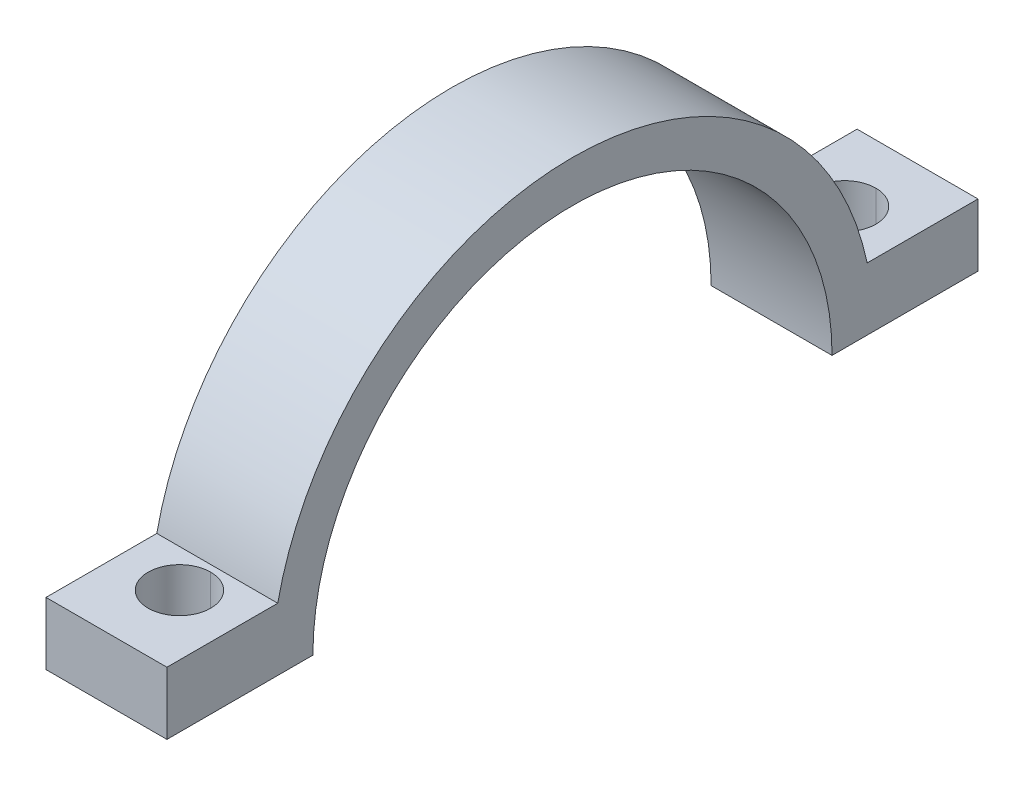
ISO-10303-21;
HEADER;
FILE_DESCRIPTION(('STEP AP214'),'2;1');
FILE_NAME('part.step','',(''),(''),'','','');
FILE_SCHEMA(('AUTOMOTIVE_DESIGN { 1 0 10303 214 1 1 1 1 }'));
ENDSEC;
DATA;
#1=APPLICATION_CONTEXT('core data for automotive mechanical design processes');
#2=APPLICATION_PROTOCOL_DEFINITION('international standard','automotive_design',2000,#1);
#3=PRODUCT_CONTEXT('',#1,'mechanical');
#4=PRODUCT('Part','Part','',(#3));
#5=PRODUCT_RELATED_PRODUCT_CATEGORY('part','',(#4));
#6=PRODUCT_DEFINITION_FORMATION('','',#4);
#7=PRODUCT_DEFINITION_CONTEXT('part definition',#1,'design');
#8=PRODUCT_DEFINITION('design','',#6,#7);
#9=PRODUCT_DEFINITION_SHAPE('','',#8);
#10=(LENGTH_UNIT() NAMED_UNIT(*) SI_UNIT(.MILLI.,.METRE.));
#11=(NAMED_UNIT(*) PLANE_ANGLE_UNIT() SI_UNIT($,.RADIAN.));
#12=(NAMED_UNIT(*) SI_UNIT($,.STERADIAN.) SOLID_ANGLE_UNIT());
#13=UNCERTAINTY_MEASURE_WITH_UNIT(LENGTH_MEASURE(1.E-05),#10,'distance_accuracy_value','');
#14=(GEOMETRIC_REPRESENTATION_CONTEXT(3) GLOBAL_UNCERTAINTY_ASSIGNED_CONTEXT((#13)) GLOBAL_UNIT_ASSIGNED_CONTEXT((#10,
#11,#12)) REPRESENTATION_CONTEXT('',''));
#15=CARTESIAN_POINT('',(0.,0.,0.));
#16=DIRECTION('',(0.,0.,1.));
#17=DIRECTION('',(1.,0.,0.));
#18=AXIS2_PLACEMENT_3D('',#15,#16,#17);
#19=CARTESIAN_POINT('',(2.9,0.,-15.95));
#20=DIRECTION('',(0.,1.,0.));
#21=DIRECTION('',(0.,0.,1.));
#22=AXIS2_PLACEMENT_3D('',#19,#20,#21);
#23=CYLINDRICAL_SURFACE('',#22,1.5);
#24=DIRECTION('',(0.,1.,0.));
#25=VECTOR('',#24,1.);
#26=CARTESIAN_POINT('',(2.9,0.,-17.45));
#27=LINE('',#26,#25);
#28=CARTESIAN_POINT('',(2.9,0.,-17.45));
#29=VERTEX_POINT('',#28);
#30=CARTESIAN_POINT('',(2.9,3.,-17.45));
#31=VERTEX_POINT('',#30);
#32=EDGE_CURVE('E207',#29,#31,#27,.T.);
#33=ORIENTED_EDGE('',*,*,#32,.F.);
#34=CARTESIAN_POINT('',(2.9,0.,-15.95));
#35=DIRECTION('',(0.,1.,0.));
#36=DIRECTION('',(0.,0.,1.));
#37=AXIS2_PLACEMENT_3D('',#34,#35,#36);
#38=CIRCLE('',#37,1.5);
#39=CARTESIAN_POINT('',(2.9,0.,-14.45));
#40=VERTEX_POINT('',#39);
#41=EDGE_CURVE('E139',#40,#29,#38,.T.);
#42=ORIENTED_EDGE('',*,*,#41,.F.);
#43=DIRECTION('',(0.,1.,0.));
#44=VECTOR('',#43,1.);
#45=CARTESIAN_POINT('',(2.9,0.,-14.45));
#46=LINE('',#45,#44);
#47=CARTESIAN_POINT('',(2.9,3.,-14.45));
#48=VERTEX_POINT('',#47);
#49=EDGE_CURVE('E202',#40,#48,#46,.T.);
#50=ORIENTED_EDGE('',*,*,#49,.T.);
#51=CARTESIAN_POINT('',(2.9,3.,-15.95));
#52=DIRECTION('',(0.,1.,0.));
#53=DIRECTION('',(0.,0.,1.));
#54=AXIS2_PLACEMENT_3D('',#51,#52,#53);
#55=CIRCLE('',#54,1.5);
#56=EDGE_CURVE('E175',#48,#31,#55,.T.);
#57=ORIENTED_EDGE('',*,*,#56,.T.);
#58=EDGE_LOOP('',(#33,#42,#50,#57));
#59=FACE_BOUND('',#58,.T.);
#60=ADVANCED_FACE('F17',(#59),#23,.F.);
#61=CARTESIAN_POINT('',(2.9,0.,15.95));
#62=DIRECTION('',(0.,1.,0.));
#63=DIRECTION('',(0.,0.,1.));
#64=AXIS2_PLACEMENT_3D('',#61,#62,#63);
#65=CYLINDRICAL_SURFACE('',#64,1.5);
#66=DIRECTION('',(0.,1.,0.));
#67=VECTOR('',#66,1.);
#68=CARTESIAN_POINT('',(2.9,0.,14.45));
#69=LINE('',#68,#67);
#70=CARTESIAN_POINT('',(2.9,0.,14.45));
#71=VERTEX_POINT('',#70);
#72=CARTESIAN_POINT('',(2.9,3.,14.45));
#73=VERTEX_POINT('',#72);
#74=EDGE_CURVE('E201',#71,#73,#69,.T.);
#75=ORIENTED_EDGE('',*,*,#74,.F.);
#76=CARTESIAN_POINT('',(2.9,0.,15.95));
#77=DIRECTION('',(0.,1.,0.));
#78=DIRECTION('',(0.,0.,1.));
#79=AXIS2_PLACEMENT_3D('',#76,#77,#78);
#80=CIRCLE('',#79,1.5);
#81=CARTESIAN_POINT('',(2.9,0.,17.45));
#82=VERTEX_POINT('',#81);
#83=EDGE_CURVE('E11',#82,#71,#80,.T.);
#84=ORIENTED_EDGE('',*,*,#83,.F.);
#85=DIRECTION('',(0.,1.,0.));
#86=VECTOR('',#85,1.);
#87=CARTESIAN_POINT('',(2.9,0.,17.45));
#88=LINE('',#87,#86);
#89=CARTESIAN_POINT('',(2.9,3.,17.45));
#90=VERTEX_POINT('',#89);
#91=EDGE_CURVE('E158',#82,#90,#88,.T.);
#92=ORIENTED_EDGE('',*,*,#91,.T.);
#93=CARTESIAN_POINT('',(2.9,3.,15.95));
#94=DIRECTION('',(0.,1.,0.));
#95=DIRECTION('',(0.,0.,1.));
#96=AXIS2_PLACEMENT_3D('',#93,#94,#95);
#97=CIRCLE('',#96,1.5);
#98=EDGE_CURVE('E217',#90,#73,#97,.T.);
#99=ORIENTED_EDGE('',*,*,#98,.T.);
#100=EDGE_LOOP('',(#75,#84,#92,#99));
#101=FACE_BOUND('',#100,.T.);
#102=ADVANCED_FACE('F291',(#101),#65,.F.);
#103=CARTESIAN_POINT('',(0.,0.,0.));
#104=DIRECTION('',(1.,0.,0.));
#105=DIRECTION('',(0.,1.,0.));
#106=AXIS2_PLACEMENT_3D('',#103,#104,#105);
#107=PLANE('',#106);
#108=CARTESIAN_POINT('',(0.,0.,0.));
#109=DIRECTION('',(-1.,0.,0.));
#110=DIRECTION('',(0.,0.,-1.));
#111=AXIS2_PLACEMENT_3D('',#108,#109,#110);
#112=CIRCLE('',#111,12.45);
#113=CARTESIAN_POINT('',(0.,0.,12.45));
#114=VERTEX_POINT('',#113);
#115=CARTESIAN_POINT('',(0.,0.,-12.45));
#116=VERTEX_POINT('',#115);
#117=EDGE_CURVE('E151',#114,#116,#112,.T.);
#118=ORIENTED_EDGE('',*,*,#117,.F.);
#119=DIRECTION('',(0.,0.,-1.));
#120=VECTOR('',#119,1.);
#121=CARTESIAN_POINT('',(0.,0.,12.45));
#122=LINE('',#121,#120);
#123=CARTESIAN_POINT('',(0.,0.,19.45));
#124=VERTEX_POINT('',#123);
#125=EDGE_CURVE('E21',#124,#114,#122,.T.);
#126=ORIENTED_EDGE('',*,*,#125,.F.);
#127=DIRECTION('',(0.,-1.,0.));
#128=VECTOR('',#127,1.);
#129=CARTESIAN_POINT('',(0.,0.,19.45));
#130=LINE('',#129,#128);
#131=CARTESIAN_POINT('',(0.,3.,19.45));
#132=VERTEX_POINT('',#131);
#133=EDGE_CURVE('E212',#132,#124,#130,.T.);
#134=ORIENTED_EDGE('',*,*,#133,.F.);
#135=DIRECTION('',(0.,0.,1.));
#136=VECTOR('',#135,1.);
#137=CARTESIAN_POINT('',(0.,3.,19.45));
#138=LINE('',#137,#136);
#139=CARTESIAN_POINT('',(0.,3.,14.1351512195661));
#140=VERTEX_POINT('',#139);
#141=EDGE_CURVE('E185',#140,#132,#138,.T.);
#142=ORIENTED_EDGE('',*,*,#141,.F.);
#143=CARTESIAN_POINT('',(0.,0.,0.));
#144=DIRECTION('',(1.,0.,0.));
#145=DIRECTION('',(0.,0.,-1.));
#146=AXIS2_PLACEMENT_3D('',#143,#144,#145);
#147=CIRCLE('',#146,14.45);
#148=CARTESIAN_POINT('',(0.,3.,-14.1351512195661));
#149=VERTEX_POINT('',#148);
#150=EDGE_CURVE('E176',#149,#140,#147,.T.);
#151=ORIENTED_EDGE('',*,*,#150,.F.);
#152=DIRECTION('',(0.,0.,1.));
#153=VECTOR('',#152,1.);
#154=CARTESIAN_POINT('',(0.,3.,-19.45));
#155=LINE('',#154,#153);
#156=CARTESIAN_POINT('',(0.,3.,-19.45));
#157=VERTEX_POINT('',#156);
#158=EDGE_CURVE('E166',#157,#149,#155,.T.);
#159=ORIENTED_EDGE('',*,*,#158,.F.);
#160=DIRECTION('',(0.,1.,0.));
#161=VECTOR('',#160,1.);
#162=CARTESIAN_POINT('',(0.,0.,-19.45));
#163=LINE('',#162,#161);
#164=CARTESIAN_POINT('',(0.,0.,-19.45));
#165=VERTEX_POINT('',#164);
#166=EDGE_CURVE('E208',#165,#157,#163,.T.);
#167=ORIENTED_EDGE('',*,*,#166,.F.);
#168=DIRECTION('',(0.,0.,-1.));
#169=VECTOR('',#168,1.);
#170=CARTESIAN_POINT('',(0.,0.,-12.45));
#171=LINE('',#170,#169);
#172=EDGE_CURVE('E232',#116,#165,#171,.T.);
#173=ORIENTED_EDGE('',*,*,#172,.F.);
#174=EDGE_LOOP('',(#118,#126,#134,#142,#151,#159,#167,#173));
#175=FACE_BOUND('',#174,.T.);
#176=ADVANCED_FACE('F274',(#175),#107,.F.);
#177=CARTESIAN_POINT('',(5.8,0.,0.));
#178=DIRECTION('',(1.,0.,0.));
#179=DIRECTION('',(0.,1.,0.));
#180=AXIS2_PLACEMENT_3D('',#177,#178,#179);
#181=PLANE('',#180);
#182=CARTESIAN_POINT('',(5.8,0.,0.));
#183=DIRECTION('',(-1.,0.,0.));
#184=DIRECTION('',(0.,0.,-1.));
#185=AXIS2_PLACEMENT_3D('',#182,#183,#184);
#186=CIRCLE('',#185,12.45);
#187=CARTESIAN_POINT('',(5.8,0.,12.45));
#188=VERTEX_POINT('',#187);
#189=CARTESIAN_POINT('',(5.8,0.,-12.45));
#190=VERTEX_POINT('',#189);
#191=EDGE_CURVE('E142',#188,#190,#186,.T.);
#192=ORIENTED_EDGE('',*,*,#191,.T.);
#193=DIRECTION('',(0.,0.,-1.));
#194=VECTOR('',#193,1.);
#195=CARTESIAN_POINT('',(5.8,0.,-12.45));
#196=LINE('',#195,#194);
#197=CARTESIAN_POINT('',(5.8,0.,-19.45));
#198=VERTEX_POINT('',#197);
#199=EDGE_CURVE('E127',#190,#198,#196,.T.);
#200=ORIENTED_EDGE('',*,*,#199,.T.);
#201=DIRECTION('',(0.,1.,0.));
#202=VECTOR('',#201,1.);
#203=CARTESIAN_POINT('',(5.8,0.,-19.45));
#204=LINE('',#203,#202);
#205=CARTESIAN_POINT('',(5.8,3.,-19.45));
#206=VERTEX_POINT('',#205);
#207=EDGE_CURVE('E163',#198,#206,#204,.T.);
#208=ORIENTED_EDGE('',*,*,#207,.T.);
#209=DIRECTION('',(0.,0.,1.));
#210=VECTOR('',#209,1.);
#211=CARTESIAN_POINT('',(5.8,3.,-19.45));
#212=LINE('',#211,#210);
#213=CARTESIAN_POINT('',(5.8,3.,-14.1351512195661));
#214=VERTEX_POINT('',#213);
#215=EDGE_CURVE('E171',#206,#214,#212,.T.);
#216=ORIENTED_EDGE('',*,*,#215,.T.);
#217=CARTESIAN_POINT('',(5.8,0.,0.));
#218=DIRECTION('',(1.,0.,0.));
#219=DIRECTION('',(0.,0.,-1.));
#220=AXIS2_PLACEMENT_3D('',#217,#218,#219);
#221=CIRCLE('',#220,14.45);
#222=CARTESIAN_POINT('',(5.8,3.,14.1351512195661));
#223=VERTEX_POINT('',#222);
#224=EDGE_CURVE('E181',#214,#223,#221,.T.);
#225=ORIENTED_EDGE('',*,*,#224,.T.);
#226=DIRECTION('',(0.,0.,1.));
#227=VECTOR('',#226,1.);
#228=CARTESIAN_POINT('',(5.8,3.,19.45));
#229=LINE('',#228,#227);
#230=CARTESIAN_POINT('',(5.8,3.,19.45));
#231=VERTEX_POINT('',#230);
#232=EDGE_CURVE('E239',#223,#231,#229,.T.);
#233=ORIENTED_EDGE('',*,*,#232,.T.);
#234=DIRECTION('',(0.,-1.,0.));
#235=VECTOR('',#234,1.);
#236=CARTESIAN_POINT('',(5.8,0.,19.45));
#237=LINE('',#236,#235);
#238=CARTESIAN_POINT('',(5.8,0.,19.45));
#239=VERTEX_POINT('',#238);
#240=EDGE_CURVE('E235',#231,#239,#237,.T.);
#241=ORIENTED_EDGE('',*,*,#240,.T.);
#242=DIRECTION('',(0.,0.,-1.));
#243=VECTOR('',#242,1.);
#244=CARTESIAN_POINT('',(5.8,0.,12.45));
#245=LINE('',#244,#243);
#246=EDGE_CURVE('E28',#239,#188,#245,.T.);
#247=ORIENTED_EDGE('',*,*,#246,.T.);
#248=EDGE_LOOP('',(#192,#200,#208,#216,#225,#233,#241,#247));
#249=FACE_BOUND('',#248,.T.);
#250=ADVANCED_FACE('F143',(#249),#181,.T.);
#251=CARTESIAN_POINT('',(5.8,0.,12.45));
#252=DIRECTION('',(0.,1.,0.));
#253=DIRECTION('',(0.,0.,-1.));
#254=AXIS2_PLACEMENT_3D('',#251,#252,#253);
#255=PLANE('',#254);
#256=ORIENTED_EDGE('',*,*,#83,.T.);
#257=CARTESIAN_POINT('',(2.9,0.,15.95));
#258=DIRECTION('',(0.,1.,0.));
#259=DIRECTION('',(0.,0.,1.));
#260=AXIS2_PLACEMENT_3D('',#257,#258,#259);
#261=CIRCLE('',#260,1.5);
#262=EDGE_CURVE('E197',#71,#82,#261,.T.);
#263=ORIENTED_EDGE('',*,*,#262,.T.);
#264=EDGE_LOOP('',(#256,#263));
#265=FACE_BOUND('',#264,.T.);
#266=ORIENTED_EDGE('',*,*,#125,.T.);
#267=DIRECTION('',(-1.,0.,0.));
#268=VECTOR('',#267,1.);
#269=CARTESIAN_POINT('',(5.8,0.,12.45));
#270=LINE('',#269,#268);
#271=EDGE_CURVE('E147',#188,#114,#270,.T.);
#272=ORIENTED_EDGE('',*,*,#271,.F.);
#273=ORIENTED_EDGE('',*,*,#246,.F.);
#274=DIRECTION('',(-1.,0.,0.));
#275=VECTOR('',#274,1.);
#276=CARTESIAN_POINT('',(5.8,0.,19.45));
#277=LINE('',#276,#275);
#278=EDGE_CURVE('E216',#239,#124,#277,.T.);
#279=ORIENTED_EDGE('',*,*,#278,.T.);
#280=EDGE_LOOP('',(#266,#272,#273,#279));
#281=FACE_BOUND('',#280,.T.);
#282=ADVANCED_FACE('F277',(#265,#281),#255,.F.);
#283=CARTESIAN_POINT('',(5.8,0.,19.45));
#284=DIRECTION('',(0.,0.,-1.));
#285=DIRECTION('',(0.,-1.,0.));
#286=AXIS2_PLACEMENT_3D('',#283,#284,#285);
#287=PLANE('',#286);
#288=ORIENTED_EDGE('',*,*,#133,.T.);
#289=ORIENTED_EDGE('',*,*,#278,.F.);
#290=ORIENTED_EDGE('',*,*,#240,.F.);
#291=DIRECTION('',(-1.,0.,0.));
#292=VECTOR('',#291,1.);
#293=CARTESIAN_POINT('',(5.8,3.,19.45));
#294=LINE('',#293,#292);
#295=EDGE_CURVE('E196',#231,#132,#294,.T.);
#296=ORIENTED_EDGE('',*,*,#295,.T.);
#297=EDGE_LOOP('',(#288,#289,#290,#296));
#298=FACE_BOUND('',#297,.T.);
#299=ADVANCED_FACE('F260',(#298),#287,.F.);
#300=CARTESIAN_POINT('',(5.8,3.,19.45));
#301=DIRECTION('',(0.,-1.,0.));
#302=DIRECTION('',(0.,0.,-1.));
#303=AXIS2_PLACEMENT_3D('',#300,#301,#302);
#304=PLANE('',#303);
#305=ORIENTED_EDGE('',*,*,#98,.F.);
#306=CARTESIAN_POINT('',(2.9,3.,15.95));
#307=DIRECTION('',(0.,1.,0.));
#308=DIRECTION('',(0.,0.,1.));
#309=AXIS2_PLACEMENT_3D('',#306,#307,#308);
#310=CIRCLE('',#309,1.5);
#311=EDGE_CURVE('E189',#73,#90,#310,.T.);
#312=ORIENTED_EDGE('',*,*,#311,.F.);
#313=EDGE_LOOP('',(#305,#312));
#314=FACE_BOUND('',#313,.T.);
#315=ORIENTED_EDGE('',*,*,#141,.T.);
#316=ORIENTED_EDGE('',*,*,#295,.F.);
#317=ORIENTED_EDGE('',*,*,#232,.F.);
#318=DIRECTION('',(-1.,0.,0.));
#319=VECTOR('',#318,1.);
#320=CARTESIAN_POINT('',(5.8,3.,14.1351512195661));
#321=LINE('',#320,#319);
#322=EDGE_CURVE('E180',#223,#140,#321,.T.);
#323=ORIENTED_EDGE('',*,*,#322,.T.);
#324=EDGE_LOOP('',(#315,#316,#317,#323));
#325=FACE_BOUND('',#324,.T.);
#326=ADVANCED_FACE('F257',(#314,#325),#304,.F.);
#327=CARTESIAN_POINT('',(5.8,0.,0.));
#328=DIRECTION('',(-1.,0.,0.));
#329=DIRECTION('',(0.,0.,1.));
#330=AXIS2_PLACEMENT_3D('',#327,#328,#329);
#331=CYLINDRICAL_SURFACE('',#330,14.45);
#332=ORIENTED_EDGE('',*,*,#150,.T.);
#333=ORIENTED_EDGE('',*,*,#322,.F.);
#334=ORIENTED_EDGE('',*,*,#224,.F.);
#335=DIRECTION('',(-1.,0.,0.));
#336=VECTOR('',#335,1.);
#337=CARTESIAN_POINT('',(5.8,3.,-14.1351512195661));
#338=LINE('',#337,#336);
#339=EDGE_CURVE('E167',#214,#149,#338,.T.);
#340=ORIENTED_EDGE('',*,*,#339,.T.);
#341=EDGE_LOOP('',(#332,#333,#334,#340));
#342=FACE_BOUND('',#341,.T.);
#343=ADVANCED_FACE('F271',(#342),#331,.T.);
#344=CARTESIAN_POINT('',(5.8,3.,-19.45));
#345=DIRECTION('',(0.,-1.,0.));
#346=DIRECTION('',(0.,0.,-1.));
#347=AXIS2_PLACEMENT_3D('',#344,#345,#346);
#348=PLANE('',#347);
#349=ORIENTED_EDGE('',*,*,#56,.F.);
#350=CARTESIAN_POINT('',(2.9,3.,-15.95));
#351=DIRECTION('',(0.,1.,0.));
#352=DIRECTION('',(0.,0.,1.));
#353=AXIS2_PLACEMENT_3D('',#350,#351,#352);
#354=CIRCLE('',#353,1.5);
#355=EDGE_CURVE('E203',#31,#48,#354,.T.);
#356=ORIENTED_EDGE('',*,*,#355,.F.);
#357=EDGE_LOOP('',(#349,#356));
#358=FACE_BOUND('',#357,.T.);
#359=ORIENTED_EDGE('',*,*,#158,.T.);
#360=ORIENTED_EDGE('',*,*,#339,.F.);
#361=ORIENTED_EDGE('',*,*,#215,.F.);
#362=DIRECTION('',(-1.,0.,0.));
#363=VECTOR('',#362,1.);
#364=CARTESIAN_POINT('',(5.8,3.,-19.45));
#365=LINE('',#364,#363);
#366=EDGE_CURVE('E161',#206,#157,#365,.T.);
#367=ORIENTED_EDGE('',*,*,#366,.T.);
#368=EDGE_LOOP('',(#359,#360,#361,#367));
#369=FACE_BOUND('',#368,.T.);
#370=ADVANCED_FACE('F316',(#358,#369),#348,.F.);
#371=CARTESIAN_POINT('',(5.8,0.,-19.45));
#372=DIRECTION('',(0.,0.,1.));
#373=DIRECTION('',(1.,0.,0.));
#374=AXIS2_PLACEMENT_3D('',#371,#372,#373);
#375=PLANE('',#374);
#376=ORIENTED_EDGE('',*,*,#166,.T.);
#377=ORIENTED_EDGE('',*,*,#366,.F.);
#378=ORIENTED_EDGE('',*,*,#207,.F.);
#379=DIRECTION('',(-1.,0.,0.));
#380=VECTOR('',#379,1.);
#381=CARTESIAN_POINT('',(5.8,0.,-19.45));
#382=LINE('',#381,#380);
#383=EDGE_CURVE('E135',#198,#165,#382,.T.);
#384=ORIENTED_EDGE('',*,*,#383,.T.);
#385=EDGE_LOOP('',(#376,#377,#378,#384));
#386=FACE_BOUND('',#385,.T.);
#387=ADVANCED_FACE('F19',(#386),#375,.F.);
#388=CARTESIAN_POINT('',(5.8,0.,-12.45));
#389=DIRECTION('',(0.,1.,0.));
#390=DIRECTION('',(1.,0.,0.));
#391=AXIS2_PLACEMENT_3D('',#388,#389,#390);
#392=PLANE('',#391);
#393=ORIENTED_EDGE('',*,*,#41,.T.);
#394=CARTESIAN_POINT('',(2.9,0.,-15.95));
#395=DIRECTION('',(0.,1.,0.));
#396=DIRECTION('',(0.,0.,1.));
#397=AXIS2_PLACEMENT_3D('',#394,#395,#396);
#398=CIRCLE('',#397,1.5);
#399=EDGE_CURVE('E223',#29,#40,#398,.T.);
#400=ORIENTED_EDGE('',*,*,#399,.T.);
#401=EDGE_LOOP('',(#393,#400));
#402=FACE_BOUND('',#401,.T.);
#403=ORIENTED_EDGE('',*,*,#172,.T.);
#404=ORIENTED_EDGE('',*,*,#383,.F.);
#405=ORIENTED_EDGE('',*,*,#199,.F.);
#406=DIRECTION('',(-1.,0.,0.));
#407=VECTOR('',#406,1.);
#408=CARTESIAN_POINT('',(5.8,0.,-12.45));
#409=LINE('',#408,#407);
#410=EDGE_CURVE('E132',#190,#116,#409,.T.);
#411=ORIENTED_EDGE('',*,*,#410,.T.);
#412=EDGE_LOOP('',(#403,#404,#405,#411));
#413=FACE_BOUND('',#412,.T.);
#414=ADVANCED_FACE('F130',(#402,#413),#392,.F.);
#415=CARTESIAN_POINT('',(5.8,0.,0.));
#416=DIRECTION('',(-1.,0.,0.));
#417=DIRECTION('',(0.,0.,1.));
#418=AXIS2_PLACEMENT_3D('',#415,#416,#417);
#419=CYLINDRICAL_SURFACE('',#418,12.45);
#420=ORIENTED_EDGE('',*,*,#117,.T.);
#421=ORIENTED_EDGE('',*,*,#410,.F.);
#422=ORIENTED_EDGE('',*,*,#191,.F.);
#423=ORIENTED_EDGE('',*,*,#271,.T.);
#424=EDGE_LOOP('',(#420,#421,#422,#423));
#425=FACE_BOUND('',#424,.T.);
#426=ADVANCED_FACE('F149',(#425),#419,.F.);
#427=CARTESIAN_POINT('',(2.9,0.,15.95));
#428=DIRECTION('',(0.,1.,0.));
#429=DIRECTION('',(0.,0.,1.));
#430=AXIS2_PLACEMENT_3D('',#427,#428,#429);
#431=CYLINDRICAL_SURFACE('',#430,1.5);
#432=ORIENTED_EDGE('',*,*,#262,.F.);
#433=ORIENTED_EDGE('',*,*,#74,.T.);
#434=ORIENTED_EDGE('',*,*,#311,.T.);
#435=ORIENTED_EDGE('',*,*,#91,.F.);
#436=EDGE_LOOP('',(#432,#433,#434,#435));
#437=FACE_BOUND('',#436,.T.);
#438=ADVANCED_FACE('F302',(#437),#431,.F.);
#439=CARTESIAN_POINT('',(2.9,0.,-15.95));
#440=DIRECTION('',(0.,1.,0.));
#441=DIRECTION('',(0.,0.,1.));
#442=AXIS2_PLACEMENT_3D('',#439,#440,#441);
#443=CYLINDRICAL_SURFACE('',#442,1.5);
#444=ORIENTED_EDGE('',*,*,#399,.F.);
#445=ORIENTED_EDGE('',*,*,#32,.T.);
#446=ORIENTED_EDGE('',*,*,#355,.T.);
#447=ORIENTED_EDGE('',*,*,#49,.F.);
#448=EDGE_LOOP('',(#444,#445,#446,#447));
#449=FACE_BOUND('',#448,.T.);
#450=ADVANCED_FACE('F304',(#449),#443,.F.);
#451=CLOSED_SHELL('',(#60,#102,#176,#250,#282,#299,#326,#343,#370,#387,#414,#426,#438,#450));
#452=MANIFOLD_SOLID_BREP('B1',#451);
#453=ADVANCED_BREP_SHAPE_REPRESENTATION('',(#18,#452),#14);
#454=SHAPE_DEFINITION_REPRESENTATION(#9,#453);
ENDSEC;
END-ISO-10303-21;
